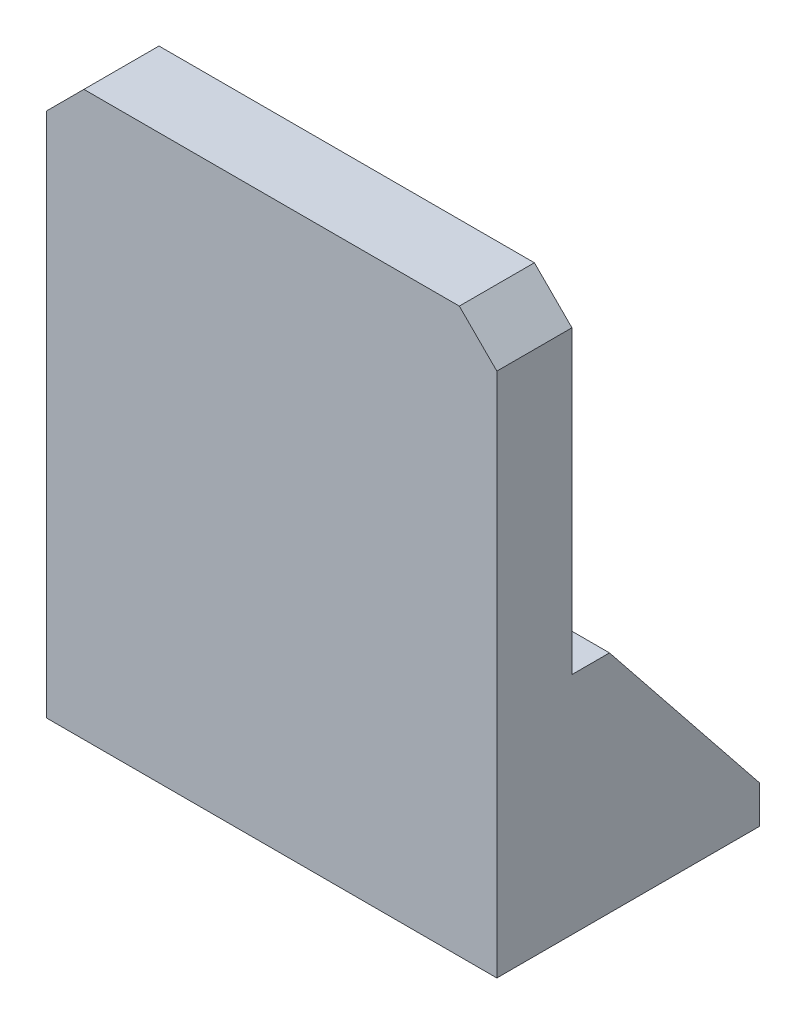
ISO-10303-21;
HEADER;
FILE_DESCRIPTION(('STEP AP214'),'2;1');
FILE_NAME('part.step','',(''),(''),'','','');
FILE_SCHEMA(('AUTOMOTIVE_DESIGN { 1 0 10303 214 1 1 1 1 }'));
ENDSEC;
DATA;
#1=APPLICATION_CONTEXT('core data for automotive mechanical design processes');
#2=APPLICATION_PROTOCOL_DEFINITION('international standard','automotive_design',2000,#1);
#3=PRODUCT_CONTEXT('',#1,'mechanical');
#4=PRODUCT('Part','Part','',(#3));
#5=PRODUCT_RELATED_PRODUCT_CATEGORY('part','',(#4));
#6=PRODUCT_DEFINITION_FORMATION('','',#4);
#7=PRODUCT_DEFINITION_CONTEXT('part definition',#1,'design');
#8=PRODUCT_DEFINITION('design','',#6,#7);
#9=PRODUCT_DEFINITION_SHAPE('','',#8);
#10=(LENGTH_UNIT() NAMED_UNIT(*) SI_UNIT(.MILLI.,.METRE.));
#11=(NAMED_UNIT(*) PLANE_ANGLE_UNIT() SI_UNIT($,.RADIAN.));
#12=(NAMED_UNIT(*) SI_UNIT($,.STERADIAN.) SOLID_ANGLE_UNIT());
#13=UNCERTAINTY_MEASURE_WITH_UNIT(LENGTH_MEASURE(1.E-05),#10,'distance_accuracy_value','');
#14=(GEOMETRIC_REPRESENTATION_CONTEXT(3) GLOBAL_UNCERTAINTY_ASSIGNED_CONTEXT((#13)) GLOBAL_UNIT_ASSIGNED_CONTEXT((#10,
#11,#12)) REPRESENTATION_CONTEXT('',''));
#15=CARTESIAN_POINT('',(0.,0.,0.));
#16=DIRECTION('',(0.,0.,1.));
#17=DIRECTION('',(1.,0.,0.));
#18=AXIS2_PLACEMENT_3D('',#15,#16,#17);
#19=CARTESIAN_POINT('',(0.,0.,-10.));
#20=DIRECTION('',(0.,0.,1.));
#21=DIRECTION('',(1.,0.,0.));
#22=AXIS2_PLACEMENT_3D('',#19,#20,#21);
#23=PLANE('',#22);
#24=DIRECTION('',(-1.,0.,0.));
#25=VECTOR('',#24,1.);
#26=CARTESIAN_POINT('',(-40.,-15.,-10.));
#27=LINE('',#26,#25);
#28=CARTESIAN_POINT('',(-40.,-15.,-10.));
#29=VERTEX_POINT('',#28);
#30=CARTESIAN_POINT('',(-60.,-15.,-10.));
#31=VERTEX_POINT('',#30);
#32=EDGE_CURVE('E144',#29,#31,#27,.T.);
#33=ORIENTED_EDGE('',*,*,#32,.T.);
#34=DIRECTION('',(0.,-1.,0.));
#35=VECTOR('',#34,1.);
#36=CARTESIAN_POINT('',(-60.,75.,-10.));
#37=LINE('',#36,#35);
#38=CARTESIAN_POINT('',(-60.,65.,-10.));
#39=VERTEX_POINT('',#38);
#40=EDGE_CURVE('E220',#39,#31,#37,.T.);
#41=ORIENTED_EDGE('',*,*,#40,.F.);
#42=DIRECTION('',(-0.707106781186549,-0.707106781186547,0.));
#43=VECTOR('',#42,1.);
#44=CARTESIAN_POINT('',(-60.,65.,-10.));
#45=LINE('',#44,#43);
#46=CARTESIAN_POINT('',(-50.,75.,-10.));
#47=VERTEX_POINT('',#46);
#48=EDGE_CURVE('E232',#39,#47,#45,.F.);
#49=ORIENTED_EDGE('',*,*,#48,.T.);
#50=DIRECTION('',(-1.,0.,0.));
#51=VECTOR('',#50,1.);
#52=CARTESIAN_POINT('',(-60.,75.,-10.));
#53=LINE('',#52,#51);
#54=CARTESIAN_POINT('',(50.,75.,-10.));
#55=VERTEX_POINT('',#54);
#56=EDGE_CURVE('E217',#55,#47,#53,.T.);
#57=ORIENTED_EDGE('',*,*,#56,.F.);
#58=DIRECTION('',(-0.707106781186547,0.707106781186548,0.));
#59=VECTOR('',#58,1.);
#60=CARTESIAN_POINT('',(50.,75.,-10.));
#61=LINE('',#60,#59);
#62=CARTESIAN_POINT('',(60.,65.,-10.));
#63=VERTEX_POINT('',#62);
#64=EDGE_CURVE('E229',#55,#63,#61,.F.);
#65=ORIENTED_EDGE('',*,*,#64,.T.);
#66=DIRECTION('',(0.,1.,0.));
#67=VECTOR('',#66,1.);
#68=CARTESIAN_POINT('',(60.,75.,-10.));
#69=LINE('',#68,#67);
#70=CARTESIAN_POINT('',(60.,-15.,-10.));
#71=VERTEX_POINT('',#70);
#72=EDGE_CURVE('E198',#71,#63,#69,.T.);
#73=ORIENTED_EDGE('',*,*,#72,.F.);
#74=DIRECTION('',(1.,0.,0.));
#75=VECTOR('',#74,1.);
#76=CARTESIAN_POINT('',(40.,-15.,-10.));
#77=LINE('',#76,#75);
#78=CARTESIAN_POINT('',(40.,-15.,-10.));
#79=VERTEX_POINT('',#78);
#80=EDGE_CURVE('E196',#79,#71,#77,.T.);
#81=ORIENTED_EDGE('',*,*,#80,.F.);
#82=DIRECTION('',(0.,-1.,0.));
#83=VECTOR('',#82,1.);
#84=CARTESIAN_POINT('',(40.,-15.,-10.));
#85=LINE('',#84,#83);
#86=CARTESIAN_POINT('',(40.,-75.,-10.));
#87=VERTEX_POINT('',#86);
#88=EDGE_CURVE('E174',#79,#87,#85,.T.);
#89=ORIENTED_EDGE('',*,*,#88,.T.);
#90=DIRECTION('',(1.,0.,0.));
#91=VECTOR('',#90,1.);
#92=CARTESIAN_POINT('',(-60.,-75.,-10.));
#93=LINE('',#92,#91);
#94=CARTESIAN_POINT('',(-40.,-75.,-10.));
#95=VERTEX_POINT('',#94);
#96=EDGE_CURVE('E57',#95,#87,#93,.T.);
#97=ORIENTED_EDGE('',*,*,#96,.F.);
#98=DIRECTION('',(0.,-1.,0.));
#99=VECTOR('',#98,1.);
#100=CARTESIAN_POINT('',(-40.,-15.,-10.));
#101=LINE('',#100,#99);
#102=EDGE_CURVE('E50',#29,#95,#101,.T.);
#103=ORIENTED_EDGE('',*,*,#102,.F.);
#104=EDGE_LOOP('',(#33,#41,#49,#57,#65,#73,#81,#89,#97,#103));
#105=FACE_BOUND('',#104,.T.);
#106=ADVANCED_FACE('F35',(#105),#23,.F.);
#107=CARTESIAN_POINT('',(60.,75.,10.));
#108=DIRECTION('',(-1.,0.,0.));
#109=DIRECTION('',(0.,-1.,0.));
#110=AXIS2_PLACEMENT_3D('',#107,#108,#109);
#111=PLANE('',#110);
#112=DIRECTION('',(0.,0.,-1.));
#113=VECTOR('',#112,1.);
#114=CARTESIAN_POINT('',(60.,-75.,10.));
#115=LINE('',#114,#113);
#116=CARTESIAN_POINT('',(60.,-75.,10.));
#117=VERTEX_POINT('',#116);
#118=CARTESIAN_POINT('',(60.,-75.,-60.));
#119=VERTEX_POINT('',#118);
#120=EDGE_CURVE('E215',#117,#119,#115,.T.);
#121=ORIENTED_EDGE('',*,*,#120,.T.);
#122=DIRECTION('',(0.,1.,0.));
#123=VECTOR('',#122,1.);
#124=CARTESIAN_POINT('',(60.,-75.,-60.));
#125=LINE('',#124,#123);
#126=CARTESIAN_POINT('',(60.,-65.,-60.));
#127=VERTEX_POINT('',#126);
#128=EDGE_CURVE('E169',#119,#127,#125,.T.);
#129=ORIENTED_EDGE('',*,*,#128,.T.);
#130=DIRECTION('',(0.,0.78086880944303,0.624695047554424));
#131=VECTOR('',#130,1.);
#132=CARTESIAN_POINT('',(60.,-65.,-60.));
#133=LINE('',#132,#131);
#134=CARTESIAN_POINT('',(60.,-15.,-20.));
#135=VERTEX_POINT('',#134);
#136=EDGE_CURVE('E191',#127,#135,#133,.T.);
#137=ORIENTED_EDGE('',*,*,#136,.T.);
#138=DIRECTION('',(0.,0.,1.));
#139=VECTOR('',#138,1.);
#140=CARTESIAN_POINT('',(60.,-15.,-20.));
#141=LINE('',#140,#139);
#142=EDGE_CURVE('E177',#135,#71,#141,.T.);
#143=ORIENTED_EDGE('',*,*,#142,.T.);
#144=ORIENTED_EDGE('',*,*,#72,.T.);
#145=DIRECTION('',(0.,0.,1.));
#146=VECTOR('',#145,1.);
#147=CARTESIAN_POINT('',(60.,65.,10.));
#148=LINE('',#147,#146);
#149=CARTESIAN_POINT('',(60.,65.,10.));
#150=VERTEX_POINT('',#149);
#151=EDGE_CURVE('E11',#63,#150,#148,.T.);
#152=ORIENTED_EDGE('',*,*,#151,.T.);
#153=DIRECTION('',(0.,1.,0.));
#154=VECTOR('',#153,1.);
#155=CARTESIAN_POINT('',(60.,75.,10.));
#156=LINE('',#155,#154);
#157=EDGE_CURVE('E205',#117,#150,#156,.T.);
#158=ORIENTED_EDGE('',*,*,#157,.F.);
#159=EDGE_LOOP('',(#121,#129,#137,#143,#144,#152,#158));
#160=FACE_BOUND('',#159,.T.);
#161=ADVANCED_FACE('F264',(#160),#111,.F.);
#162=CARTESIAN_POINT('',(-60.,75.,10.));
#163=DIRECTION('',(0.,-1.,0.));
#164=DIRECTION('',(0.,0.,-1.));
#165=AXIS2_PLACEMENT_3D('',#162,#163,#164);
#166=PLANE('',#165);
#167=ORIENTED_EDGE('',*,*,#56,.T.);
#168=DIRECTION('',(0.,0.,1.));
#169=VECTOR('',#168,1.);
#170=CARTESIAN_POINT('',(-50.,75.,10.));
#171=LINE('',#170,#169);
#172=CARTESIAN_POINT('',(-50.,75.,10.));
#173=VERTEX_POINT('',#172);
#174=EDGE_CURVE('E237',#47,#173,#171,.T.);
#175=ORIENTED_EDGE('',*,*,#174,.T.);
#176=DIRECTION('',(-1.,0.,0.));
#177=VECTOR('',#176,1.);
#178=CARTESIAN_POINT('',(-60.,75.,10.));
#179=LINE('',#178,#177);
#180=CARTESIAN_POINT('',(50.,75.,10.));
#181=VERTEX_POINT('',#180);
#182=EDGE_CURVE('E208',#181,#173,#179,.T.);
#183=ORIENTED_EDGE('',*,*,#182,.F.);
#184=DIRECTION('',(0.,0.,-1.));
#185=VECTOR('',#184,1.);
#186=CARTESIAN_POINT('',(50.,75.,10.));
#187=LINE('',#186,#185);
#188=EDGE_CURVE('E234',#181,#55,#187,.T.);
#189=ORIENTED_EDGE('',*,*,#188,.T.);
#190=EDGE_LOOP('',(#167,#175,#183,#189));
#191=FACE_BOUND('',#190,.T.);
#192=ADVANCED_FACE('F256',(#191),#166,.F.);
#193=CARTESIAN_POINT('',(-60.,75.,10.));
#194=DIRECTION('',(1.,0.,0.));
#195=DIRECTION('',(0.,1.,0.));
#196=AXIS2_PLACEMENT_3D('',#193,#194,#195);
#197=PLANE('',#196);
#198=DIRECTION('',(0.,-1.,0.));
#199=VECTOR('',#198,1.);
#200=CARTESIAN_POINT('',(-60.,75.,10.));
#201=LINE('',#200,#199);
#202=CARTESIAN_POINT('',(-60.,65.,10.));
#203=VERTEX_POINT('',#202);
#204=CARTESIAN_POINT('',(-60.,-75.,10.));
#205=VERTEX_POINT('',#204);
#206=EDGE_CURVE('E211',#203,#205,#201,.T.);
#207=ORIENTED_EDGE('',*,*,#206,.F.);
#208=DIRECTION('',(0.,0.,-1.));
#209=VECTOR('',#208,1.);
#210=CARTESIAN_POINT('',(-60.,65.,10.));
#211=LINE('',#210,#209);
#212=EDGE_CURVE('E226',#203,#39,#211,.T.);
#213=ORIENTED_EDGE('',*,*,#212,.T.);
#214=ORIENTED_EDGE('',*,*,#40,.T.);
#215=DIRECTION('',(0.,0.,1.));
#216=VECTOR('',#215,1.);
#217=CARTESIAN_POINT('',(-60.,-15.,-20.));
#218=LINE('',#217,#216);
#219=CARTESIAN_POINT('',(-60.,-15.,-20.));
#220=VERTEX_POINT('',#219);
#221=EDGE_CURVE('E147',#220,#31,#218,.T.);
#222=ORIENTED_EDGE('',*,*,#221,.F.);
#223=DIRECTION('',(0.,0.78086880944303,0.624695047554424));
#224=VECTOR('',#223,1.);
#225=CARTESIAN_POINT('',(-60.,-65.,-60.));
#226=LINE('',#225,#224);
#227=CARTESIAN_POINT('',(-60.,-65.,-60.));
#228=VERTEX_POINT('',#227);
#229=EDGE_CURVE('E157',#228,#220,#226,.T.);
#230=ORIENTED_EDGE('',*,*,#229,.F.);
#231=DIRECTION('',(0.,1.,0.));
#232=VECTOR('',#231,1.);
#233=CARTESIAN_POINT('',(-60.,-75.,-60.));
#234=LINE('',#233,#232);
#235=CARTESIAN_POINT('',(-60.,-75.,-60.));
#236=VERTEX_POINT('',#235);
#237=EDGE_CURVE('E155',#236,#228,#234,.T.);
#238=ORIENTED_EDGE('',*,*,#237,.F.);
#239=DIRECTION('',(0.,0.,-1.));
#240=VECTOR('',#239,1.);
#241=CARTESIAN_POINT('',(-60.,-75.,10.));
#242=LINE('',#241,#240);
#243=EDGE_CURVE('E224',#205,#236,#242,.T.);
#244=ORIENTED_EDGE('',*,*,#243,.F.);
#245=EDGE_LOOP('',(#207,#213,#214,#222,#230,#238,#244));
#246=FACE_BOUND('',#245,.T.);
#247=ADVANCED_FACE('F250',(#246),#197,.F.);
#248=CARTESIAN_POINT('',(-60.,-75.,10.));
#249=DIRECTION('',(0.,1.,0.));
#250=DIRECTION('',(0.,0.,1.));
#251=AXIS2_PLACEMENT_3D('',#248,#249,#250);
#252=PLANE('',#251);
#253=ORIENTED_EDGE('',*,*,#243,.T.);
#254=DIRECTION('',(-1.,0.,0.));
#255=VECTOR('',#254,1.);
#256=CARTESIAN_POINT('',(-40.,-75.,-60.));
#257=LINE('',#256,#255);
#258=CARTESIAN_POINT('',(-40.,-75.,-60.));
#259=VERTEX_POINT('',#258);
#260=EDGE_CURVE('E166',#259,#236,#257,.T.);
#261=ORIENTED_EDGE('',*,*,#260,.F.);
#262=DIRECTION('',(0.,0.,-1.));
#263=VECTOR('',#262,1.);
#264=CARTESIAN_POINT('',(-40.,-75.,-10.));
#265=LINE('',#264,#263);
#266=EDGE_CURVE('E152',#95,#259,#265,.T.);
#267=ORIENTED_EDGE('',*,*,#266,.F.);
#268=ORIENTED_EDGE('',*,*,#96,.T.);
#269=DIRECTION('',(0.,0.,-1.));
#270=VECTOR('',#269,1.);
#271=CARTESIAN_POINT('',(40.,-75.,-10.));
#272=LINE('',#271,#270);
#273=CARTESIAN_POINT('',(40.,-75.,-60.));
#274=VERTEX_POINT('',#273);
#275=EDGE_CURVE('E176',#87,#274,#272,.T.);
#276=ORIENTED_EDGE('',*,*,#275,.T.);
#277=DIRECTION('',(1.,0.,0.));
#278=VECTOR('',#277,1.);
#279=CARTESIAN_POINT('',(40.,-75.,-60.));
#280=LINE('',#279,#278);
#281=EDGE_CURVE('E188',#274,#119,#280,.T.);
#282=ORIENTED_EDGE('',*,*,#281,.T.);
#283=ORIENTED_EDGE('',*,*,#120,.F.);
#284=DIRECTION('',(1.,0.,0.));
#285=VECTOR('',#284,1.);
#286=CARTESIAN_POINT('',(-60.,-75.,10.));
#287=LINE('',#286,#285);
#288=EDGE_CURVE('E213',#205,#117,#287,.T.);
#289=ORIENTED_EDGE('',*,*,#288,.F.);
#290=EDGE_LOOP('',(#253,#261,#267,#268,#276,#282,#283,#289));
#291=FACE_BOUND('',#290,.T.);
#292=ADVANCED_FACE('F275',(#291),#252,.F.);
#293=CARTESIAN_POINT('',(0.,0.,10.));
#294=DIRECTION('',(0.,0.,1.));
#295=DIRECTION('',(1.,0.,0.));
#296=AXIS2_PLACEMENT_3D('',#293,#294,#295);
#297=PLANE('',#296);
#298=ORIENTED_EDGE('',*,*,#182,.T.);
#299=DIRECTION('',(0.707106781186549,0.707106781186547,0.));
#300=VECTOR('',#299,1.);
#301=CARTESIAN_POINT('',(-62.4999999999999,62.5000000000001,10.));
#302=LINE('',#301,#300);
#303=EDGE_CURVE('E43',#173,#203,#302,.F.);
#304=ORIENTED_EDGE('',*,*,#303,.T.);
#305=ORIENTED_EDGE('',*,*,#206,.T.);
#306=ORIENTED_EDGE('',*,*,#288,.T.);
#307=ORIENTED_EDGE('',*,*,#157,.T.);
#308=DIRECTION('',(0.707106781186547,-0.707106781186548,0.));
#309=VECTOR('',#308,1.);
#310=CARTESIAN_POINT('',(62.5,62.4999999999999,10.));
#311=LINE('',#310,#309);
#312=EDGE_CURVE('E239',#150,#181,#311,.F.);
#313=ORIENTED_EDGE('',*,*,#312,.T.);
#314=EDGE_LOOP('',(#298,#304,#305,#306,#307,#313));
#315=FACE_BOUND('',#314,.T.);
#316=ADVANCED_FACE('F243',(#315),#297,.T.);
#317=CARTESIAN_POINT('',(-60.,65.,10.));
#318=DIRECTION('',(0.707106781186547,-0.707106781186549,0.));
#319=DIRECTION('',(0.,0.,-1.));
#320=AXIS2_PLACEMENT_3D('',#317,#318,#319);
#321=PLANE('',#320);
#322=ORIENTED_EDGE('',*,*,#303,.F.);
#323=ORIENTED_EDGE('',*,*,#174,.F.);
#324=ORIENTED_EDGE('',*,*,#48,.F.);
#325=ORIENTED_EDGE('',*,*,#212,.F.);
#326=EDGE_LOOP('',(#322,#323,#324,#325));
#327=FACE_BOUND('',#326,.T.);
#328=ADVANCED_FACE('F253',(#327),#321,.F.);
#329=CARTESIAN_POINT('',(50.,75.,10.));
#330=DIRECTION('',(-0.707106781186548,-0.707106781186547,0.));
#331=DIRECTION('',(0.,0.,-1.));
#332=AXIS2_PLACEMENT_3D('',#329,#330,#331);
#333=PLANE('',#332);
#334=ORIENTED_EDGE('',*,*,#312,.F.);
#335=ORIENTED_EDGE('',*,*,#151,.F.);
#336=ORIENTED_EDGE('',*,*,#64,.F.);
#337=ORIENTED_EDGE('',*,*,#188,.F.);
#338=EDGE_LOOP('',(#334,#335,#336,#337));
#339=FACE_BOUND('',#338,.T.);
#340=ADVANCED_FACE('F37',(#339),#333,.F.);
#341=CARTESIAN_POINT('',(40.,-15.,-20.));
#342=DIRECTION('',(0.,1.,0.));
#343=DIRECTION('',(0.,0.,1.));
#344=AXIS2_PLACEMENT_3D('',#341,#342,#343);
#345=PLANE('',#344);
#346=ORIENTED_EDGE('',*,*,#142,.F.);
#347=DIRECTION('',(1.,0.,0.));
#348=VECTOR('',#347,1.);
#349=CARTESIAN_POINT('',(40.,-15.,-20.));
#350=LINE('',#349,#348);
#351=CARTESIAN_POINT('',(40.,-15.,-20.));
#352=VERTEX_POINT('',#351);
#353=EDGE_CURVE('E199',#352,#135,#350,.T.);
#354=ORIENTED_EDGE('',*,*,#353,.F.);
#355=DIRECTION('',(0.,0.,1.));
#356=VECTOR('',#355,1.);
#357=CARTESIAN_POINT('',(40.,-15.,-20.));
#358=LINE('',#357,#356);
#359=EDGE_CURVE('E185',#352,#79,#358,.T.);
#360=ORIENTED_EDGE('',*,*,#359,.T.);
#361=ORIENTED_EDGE('',*,*,#80,.T.);
#362=EDGE_LOOP('',(#346,#354,#360,#361));
#363=FACE_BOUND('',#362,.T.);
#364=ADVANCED_FACE('F269',(#363),#345,.T.);
#365=CARTESIAN_POINT('',(40.,-65.,-60.));
#366=DIRECTION('',(0.,0.624695047554424,-0.78086880944303));
#367=DIRECTION('',(0.,0.78086880944303,0.624695047554424));
#368=AXIS2_PLACEMENT_3D('',#365,#366,#367);
#369=PLANE('',#368);
#370=ORIENTED_EDGE('',*,*,#136,.F.);
#371=DIRECTION('',(1.,0.,0.));
#372=VECTOR('',#371,1.);
#373=CARTESIAN_POINT('',(40.,-65.,-60.));
#374=LINE('',#373,#372);
#375=CARTESIAN_POINT('',(40.,-65.,-60.));
#376=VERTEX_POINT('',#375);
#377=EDGE_CURVE('E201',#376,#127,#374,.T.);
#378=ORIENTED_EDGE('',*,*,#377,.F.);
#379=DIRECTION('',(0.,0.78086880944303,0.624695047554424));
#380=VECTOR('',#379,1.);
#381=CARTESIAN_POINT('',(40.,-65.,-60.));
#382=LINE('',#381,#380);
#383=EDGE_CURVE('E182',#376,#352,#382,.T.);
#384=ORIENTED_EDGE('',*,*,#383,.T.);
#385=ORIENTED_EDGE('',*,*,#353,.T.);
#386=EDGE_LOOP('',(#370,#378,#384,#385));
#387=FACE_BOUND('',#386,.T.);
#388=ADVANCED_FACE('F348',(#387),#369,.T.);
#389=CARTESIAN_POINT('',(40.,-75.,-60.));
#390=DIRECTION('',(0.,0.,-1.));
#391=DIRECTION('',(-1.,0.,0.));
#392=AXIS2_PLACEMENT_3D('',#389,#390,#391);
#393=PLANE('',#392);
#394=ORIENTED_EDGE('',*,*,#128,.F.);
#395=ORIENTED_EDGE('',*,*,#281,.F.);
#396=DIRECTION('',(0.,1.,0.));
#397=VECTOR('',#396,1.);
#398=CARTESIAN_POINT('',(40.,-75.,-60.));
#399=LINE('',#398,#397);
#400=EDGE_CURVE('E179',#274,#376,#399,.T.);
#401=ORIENTED_EDGE('',*,*,#400,.T.);
#402=ORIENTED_EDGE('',*,*,#377,.T.);
#403=EDGE_LOOP('',(#394,#395,#401,#402));
#404=FACE_BOUND('',#403,.T.);
#405=ADVANCED_FACE('F279',(#404),#393,.T.);
#406=CARTESIAN_POINT('',(40.,0.,0.));
#407=DIRECTION('',(1.,0.,0.));
#408=DIRECTION('',(0.,1.,0.));
#409=AXIS2_PLACEMENT_3D('',#406,#407,#408);
#410=PLANE('',#409);
#411=ORIENTED_EDGE('',*,*,#88,.F.);
#412=ORIENTED_EDGE('',*,*,#359,.F.);
#413=ORIENTED_EDGE('',*,*,#383,.F.);
#414=ORIENTED_EDGE('',*,*,#400,.F.);
#415=ORIENTED_EDGE('',*,*,#275,.F.);
#416=EDGE_LOOP('',(#411,#412,#413,#414,#415));
#417=FACE_BOUND('',#416,.T.);
#418=ADVANCED_FACE('F273',(#417),#410,.F.);
#419=CARTESIAN_POINT('',(-40.,-75.,-60.));
#420=DIRECTION('',(0.,0.,1.));
#421=DIRECTION('',(1.,0.,0.));
#422=AXIS2_PLACEMENT_3D('',#419,#420,#421);
#423=PLANE('',#422);
#424=ORIENTED_EDGE('',*,*,#237,.T.);
#425=DIRECTION('',(-1.,0.,0.));
#426=VECTOR('',#425,1.);
#427=CARTESIAN_POINT('',(-40.,-65.,-60.));
#428=LINE('',#427,#426);
#429=CARTESIAN_POINT('',(-40.,-65.,-60.));
#430=VERTEX_POINT('',#429);
#431=EDGE_CURVE('E170',#430,#228,#428,.T.);
#432=ORIENTED_EDGE('',*,*,#431,.F.);
#433=DIRECTION('',(0.,1.,0.));
#434=VECTOR('',#433,1.);
#435=CARTESIAN_POINT('',(-40.,-75.,-60.));
#436=LINE('',#435,#434);
#437=EDGE_CURVE('E161',#259,#430,#436,.T.);
#438=ORIENTED_EDGE('',*,*,#437,.F.);
#439=ORIENTED_EDGE('',*,*,#260,.T.);
#440=EDGE_LOOP('',(#424,#432,#438,#439));
#441=FACE_BOUND('',#440,.T.);
#442=ADVANCED_FACE('F283',(#441),#423,.F.);
#443=CARTESIAN_POINT('',(-40.,-65.,-60.));
#444=DIRECTION('',(0.,-0.624695047554424,0.78086880944303));
#445=DIRECTION('',(0.,-0.78086880944303,-0.624695047554424));
#446=AXIS2_PLACEMENT_3D('',#443,#444,#445);
#447=PLANE('',#446);
#448=ORIENTED_EDGE('',*,*,#229,.T.);
#449=DIRECTION('',(-1.,0.,0.));
#450=VECTOR('',#449,1.);
#451=CARTESIAN_POINT('',(-40.,-15.,-20.));
#452=LINE('',#451,#450);
#453=CARTESIAN_POINT('',(-40.,-15.,-20.));
#454=VERTEX_POINT('',#453);
#455=EDGE_CURVE('E151',#454,#220,#452,.T.);
#456=ORIENTED_EDGE('',*,*,#455,.F.);
#457=DIRECTION('',(0.,0.78086880944303,0.624695047554424));
#458=VECTOR('',#457,1.);
#459=CARTESIAN_POINT('',(-40.,-65.,-60.));
#460=LINE('',#459,#458);
#461=EDGE_CURVE('E138',#430,#454,#460,.T.);
#462=ORIENTED_EDGE('',*,*,#461,.F.);
#463=ORIENTED_EDGE('',*,*,#431,.T.);
#464=EDGE_LOOP('',(#448,#456,#462,#463));
#465=FACE_BOUND('',#464,.T.);
#466=ADVANCED_FACE('F287',(#465),#447,.F.);
#467=CARTESIAN_POINT('',(-40.,-15.,-20.));
#468=DIRECTION('',(0.,-1.,0.));
#469=DIRECTION('',(0.,0.,-1.));
#470=AXIS2_PLACEMENT_3D('',#467,#468,#469);
#471=PLANE('',#470);
#472=ORIENTED_EDGE('',*,*,#221,.T.);
#473=ORIENTED_EDGE('',*,*,#32,.F.);
#474=DIRECTION('',(0.,0.,1.));
#475=VECTOR('',#474,1.);
#476=CARTESIAN_POINT('',(-40.,-15.,-20.));
#477=LINE('',#476,#475);
#478=EDGE_CURVE('E134',#454,#29,#477,.T.);
#479=ORIENTED_EDGE('',*,*,#478,.F.);
#480=ORIENTED_EDGE('',*,*,#455,.T.);
#481=EDGE_LOOP('',(#472,#473,#479,#480));
#482=FACE_BOUND('',#481,.T.);
#483=ADVANCED_FACE('F145',(#482),#471,.F.);
#484=CARTESIAN_POINT('',(-40.,0.,0.));
#485=DIRECTION('',(-1.,0.,0.));
#486=DIRECTION('',(0.,1.,0.));
#487=AXIS2_PLACEMENT_3D('',#484,#485,#486);
#488=PLANE('',#487);
#489=ORIENTED_EDGE('',*,*,#102,.T.);
#490=ORIENTED_EDGE('',*,*,#266,.T.);
#491=ORIENTED_EDGE('',*,*,#437,.T.);
#492=ORIENTED_EDGE('',*,*,#461,.T.);
#493=ORIENTED_EDGE('',*,*,#478,.T.);
#494=EDGE_LOOP('',(#489,#490,#491,#492,#493));
#495=FACE_BOUND('',#494,.T.);
#496=ADVANCED_FACE('F136',(#495),#488,.F.);
#497=CLOSED_SHELL('',(#106,#161,#192,#247,#292,#316,#328,#340,#364,#388,#405,#418,#442,#466,
#483,#496));
#498=MANIFOLD_SOLID_BREP('B2',#497);
#499=ADVANCED_BREP_SHAPE_REPRESENTATION('',(#18,#498),#14);
#500=SHAPE_DEFINITION_REPRESENTATION(#9,#499);
ENDSEC;
END-ISO-10303-21;
